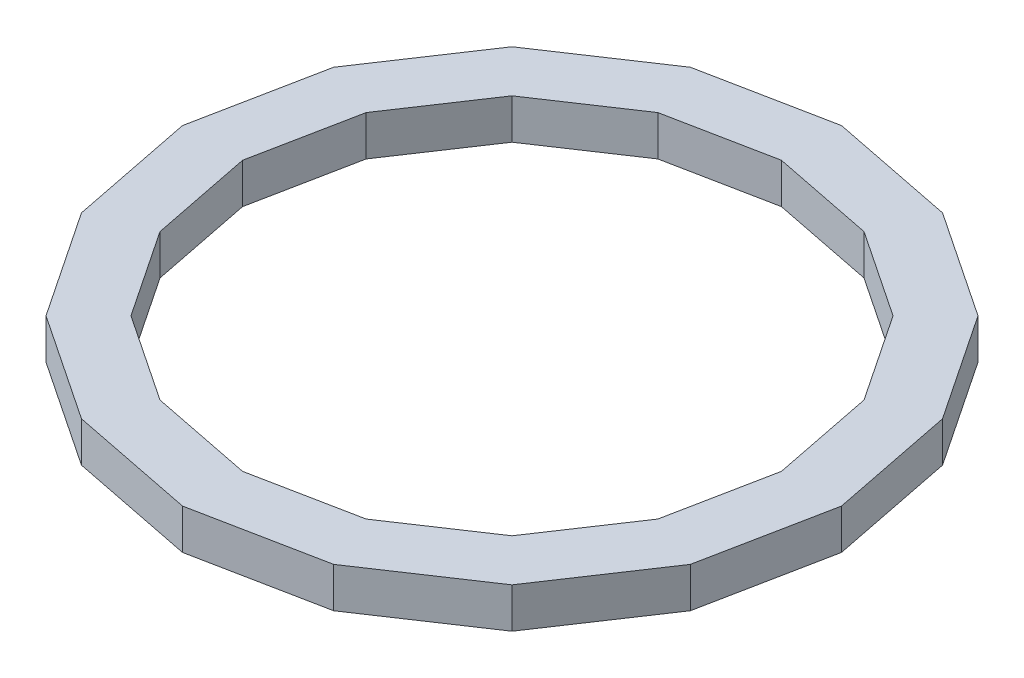
ISO-10303-21;
HEADER;
FILE_DESCRIPTION(('STEP AP214'),'2;1');
FILE_NAME('part.step','',(''),(''),'','','');
FILE_SCHEMA(('AUTOMOTIVE_DESIGN { 1 0 10303 214 1 1 1 1 }'));
ENDSEC;
DATA;
#1=APPLICATION_CONTEXT('core data for automotive mechanical design processes');
#2=APPLICATION_PROTOCOL_DEFINITION('international standard','automotive_design',2000,#1);
#3=PRODUCT_CONTEXT('',#1,'mechanical');
#4=PRODUCT('Part','Part','',(#3));
#5=PRODUCT_RELATED_PRODUCT_CATEGORY('part','',(#4));
#6=PRODUCT_DEFINITION_FORMATION('','',#4);
#7=PRODUCT_DEFINITION_CONTEXT('part definition',#1,'design');
#8=PRODUCT_DEFINITION('design','',#6,#7);
#9=PRODUCT_DEFINITION_SHAPE('','',#8);
#10=(LENGTH_UNIT() NAMED_UNIT(*) SI_UNIT(.MILLI.,.METRE.));
#11=(NAMED_UNIT(*) PLANE_ANGLE_UNIT() SI_UNIT($,.RADIAN.));
#12=(NAMED_UNIT(*) SI_UNIT($,.STERADIAN.) SOLID_ANGLE_UNIT());
#13=UNCERTAINTY_MEASURE_WITH_UNIT(LENGTH_MEASURE(1.E-05),#10,'distance_accuracy_value','');
#14=(GEOMETRIC_REPRESENTATION_CONTEXT(3) GLOBAL_UNCERTAINTY_ASSIGNED_CONTEXT((#13)) GLOBAL_UNIT_ASSIGNED_CONTEXT((#10,
#11,#12)) REPRESENTATION_CONTEXT('',''));
#15=CARTESIAN_POINT('',(0.,0.,0.));
#16=DIRECTION('',(0.,0.,1.));
#17=DIRECTION('',(1.,0.,0.));
#18=AXIS2_PLACEMENT_3D('',#15,#16,#17);
#19=CARTESIAN_POINT('',(0.,19.05,0.));
#20=DIRECTION('',(0.,1.,0.));
#21=DIRECTION('',(0.,0.,1.));
#22=AXIS2_PLACEMENT_3D('',#19,#20,#21);
#23=PLANE('',#22);
#24=DIRECTION('',(0.195090322016118,0.,-0.980785280403233));
#25=VECTOR('',#24,1.);
#26=CARTESIAN_POINT('',(144.34261966422,19.05,59.7886706933794));
#27=LINE('',#26,#25);
#28=CARTESIAN_POINT('',(144.34261966422,19.05,59.7886706933794));
#29=VERTEX_POINT('',#28);
#30=CARTESIAN_POINT('',(156.235325694322,19.05,-1.53332393890629E-12));
#31=VERTEX_POINT('',#30);
#32=EDGE_CURVE('E367',#29,#31,#27,.T.);
#33=ORIENTED_EDGE('',*,*,#32,.T.);
#34=DIRECTION('',(-0.195090322016139,0.,-0.980785280403228));
#35=VECTOR('',#34,1.);
#36=CARTESIAN_POINT('',(156.235325694322,19.05,-1.53332393890629E-12));
#37=LINE('',#36,#35);
#38=CARTESIAN_POINT('',(144.342619664218,19.05,-59.7886706933825));
#39=VERTEX_POINT('',#38);
#40=EDGE_CURVE('E370',#31,#39,#37,.T.);
#41=ORIENTED_EDGE('',*,*,#40,.T.);
#42=DIRECTION('',(-0.555570233019611,0.,-0.831469612302539));
#43=VECTOR('',#42,1.);
#44=CARTESIAN_POINT('',(144.342619664218,19.05,-59.7886706933825));
#45=LINE('',#44,#43);
#46=CARTESIAN_POINT('',(110.475058259343,19.05,-110.475058259345));
#47=VERTEX_POINT('',#46);
#48=EDGE_CURVE('E374',#39,#47,#45,.T.);
#49=ORIENTED_EDGE('',*,*,#48,.T.);
#50=DIRECTION('',(-0.831469612302551,0.,-0.555570233019593));
#51=VECTOR('',#50,1.);
#52=CARTESIAN_POINT('',(110.475058259343,19.05,-110.475058259345));
#53=LINE('',#52,#51);
#54=CARTESIAN_POINT('',(59.7886706933795,19.05,-144.34261966422));
#55=VERTEX_POINT('',#54);
#56=EDGE_CURVE('E376',#47,#55,#53,.T.);
#57=ORIENTED_EDGE('',*,*,#56,.T.);
#58=DIRECTION('',(-0.980785280403232,0.,-0.195090322016118));
#59=VECTOR('',#58,1.);
#60=CARTESIAN_POINT('',(59.7886706933795,19.05,-144.34261966422));
#61=LINE('',#60,#59);
#62=CARTESIAN_POINT('',(-1.71396367748445E-12,19.05,-156.235325694322));
#63=VERTEX_POINT('',#62);
#64=EDGE_CURVE('E378',#55,#63,#61,.T.);
#65=ORIENTED_EDGE('',*,*,#64,.T.);
#66=DIRECTION('',(-0.980785280403228,0.,0.195090322016139));
#67=VECTOR('',#66,1.);
#68=CARTESIAN_POINT('',(-1.71396367748445E-12,19.05,-156.235325694322));
#69=LINE('',#68,#67);
#70=CARTESIAN_POINT('',(-59.7886706933825,19.05,-144.342619664218));
#71=VERTEX_POINT('',#70);
#72=EDGE_CURVE('E380',#63,#71,#69,.T.);
#73=ORIENTED_EDGE('',*,*,#72,.T.);
#74=DIRECTION('',(-0.831469612302539,0.,0.555570233019611));
#75=VECTOR('',#74,1.);
#76=CARTESIAN_POINT('',(-59.7886706933825,19.05,-144.342619664218));
#77=LINE('',#76,#75);
#78=CARTESIAN_POINT('',(-110.475058259345,19.05,-110.475058259343));
#79=VERTEX_POINT('',#78);
#80=EDGE_CURVE('E382',#71,#79,#77,.T.);
#81=ORIENTED_EDGE('',*,*,#80,.T.);
#82=DIRECTION('',(-0.555570233019593,0.,0.831469612302551));
#83=VECTOR('',#82,1.);
#84=CARTESIAN_POINT('',(-110.475058259345,19.05,-110.475058259343));
#85=LINE('',#84,#83);
#86=CARTESIAN_POINT('',(-144.34261966422,19.05,-59.7886706933793));
#87=VERTEX_POINT('',#86);
#88=EDGE_CURVE('E384',#79,#87,#85,.T.);
#89=ORIENTED_EDGE('',*,*,#88,.T.);
#90=DIRECTION('',(-0.195090322016118,0.,0.980785280403232));
#91=VECTOR('',#90,1.);
#92=CARTESIAN_POINT('',(-144.34261966422,19.05,-59.7886706933793));
#93=LINE('',#92,#91);
#94=CARTESIAN_POINT('',(-156.235325694322,19.05,1.74513715930515E-12));
#95=VERTEX_POINT('',#94);
#96=EDGE_CURVE('E386',#87,#95,#93,.T.);
#97=ORIENTED_EDGE('',*,*,#96,.T.);
#98=DIRECTION('',(0.195090322016139,0.,0.980785280403228));
#99=VECTOR('',#98,1.);
#100=CARTESIAN_POINT('',(-156.235325694322,19.05,1.74513715930515E-12));
#101=LINE('',#100,#99);
#102=CARTESIAN_POINT('',(-144.342619664218,19.05,59.7886706933825));
#103=VERTEX_POINT('',#102);
#104=EDGE_CURVE('E388',#95,#103,#101,.T.);
#105=ORIENTED_EDGE('',*,*,#104,.T.);
#106=DIRECTION('',(0.555570233019611,0.,0.831469612302539));
#107=VECTOR('',#106,1.);
#108=CARTESIAN_POINT('',(-144.342619664218,19.05,59.7886706933825));
#109=LINE('',#108,#107);
#110=CARTESIAN_POINT('',(-110.475058259343,19.05,110.475058259345));
#111=VERTEX_POINT('',#110);
#112=EDGE_CURVE('E390',#103,#111,#109,.T.);
#113=ORIENTED_EDGE('',*,*,#112,.T.);
#114=DIRECTION('',(0.831469612302551,0.,0.555570233019593));
#115=VECTOR('',#114,1.);
#116=CARTESIAN_POINT('',(-110.475058259343,19.05,110.475058259345));
#117=LINE('',#116,#115);
#118=CARTESIAN_POINT('',(-59.7886706933793,19.05,144.34261966422));
#119=VERTEX_POINT('',#118);
#120=EDGE_CURVE('E392',#111,#119,#117,.T.);
#121=ORIENTED_EDGE('',*,*,#120,.T.);
#122=DIRECTION('',(0.980785280403232,0.,0.195090322016118));
#123=VECTOR('',#122,1.);
#124=CARTESIAN_POINT('',(-59.7886706933793,19.05,144.34261966422));
#125=LINE('',#124,#123);
#126=CARTESIAN_POINT('',(1.65930643270855E-12,19.05,156.235325694322));
#127=VERTEX_POINT('',#126);
#128=EDGE_CURVE('E394',#119,#127,#125,.T.);
#129=ORIENTED_EDGE('',*,*,#128,.T.);
#130=DIRECTION('',(0.980785280403228,0.,-0.195090322016139));
#131=VECTOR('',#130,1.);
#132=CARTESIAN_POINT('',(1.65930643270855E-12,19.05,156.235325694322));
#133=LINE('',#132,#131);
#134=CARTESIAN_POINT('',(59.7886706933825,19.05,144.342619664218));
#135=VERTEX_POINT('',#134);
#136=EDGE_CURVE('E397',#127,#135,#133,.T.);
#137=ORIENTED_EDGE('',*,*,#136,.T.);
#138=DIRECTION('',(0.831469612302539,0.,-0.555570233019611));
#139=VECTOR('',#138,1.);
#140=CARTESIAN_POINT('',(59.7886706933825,19.05,144.342619664218));
#141=LINE('',#140,#139);
#142=CARTESIAN_POINT('',(110.475058259345,19.05,110.475058259343));
#143=VERTEX_POINT('',#142);
#144=EDGE_CURVE('E399',#135,#143,#141,.T.);
#145=ORIENTED_EDGE('',*,*,#144,.T.);
#146=DIRECTION('',(0.555570233019593,0.,-0.831469612302551));
#147=VECTOR('',#146,1.);
#148=CARTESIAN_POINT('',(110.475058259345,19.05,110.475058259343));
#149=LINE('',#148,#147);
#150=EDGE_CURVE('E401',#143,#29,#149,.T.);
#151=ORIENTED_EDGE('',*,*,#150,.T.);
#152=EDGE_LOOP('',(#33,#41,#49,#57,#65,#73,#81,#89,#97,#105,#113,#121,#129,#137,#145,#151));
#153=FACE_BOUND('',#152,.T.);
#154=DIRECTION('',(-0.195090322016139,0.,-0.980785280403228));
#155=VECTOR('',#154,1.);
#156=CARTESIAN_POINT('',(127.747948733982,19.05,-1.42966776699409E-12));
#157=LINE('',#156,#155);
#158=CARTESIAN_POINT('',(127.747948733982,19.05,-1.42966776699409E-12));
#159=VERTEX_POINT('',#158);
#160=CARTESIAN_POINT('',(118.023715155626,19.05,-48.8870234991209));
#161=VERTEX_POINT('',#160);
#162=EDGE_CURVE('E252',#159,#161,#157,.T.);
#163=ORIENTED_EDGE('',*,*,#162,.F.);
#164=DIRECTION('',(0.195090322016118,0.,-0.980785280403233));
#165=VECTOR('',#164,1.);
#166=CARTESIAN_POINT('',(118.023715155627,19.05,48.8870234991184));
#167=LINE('',#166,#165);
#168=CARTESIAN_POINT('',(118.023715155627,19.05,48.8870234991184));
#169=VERTEX_POINT('',#168);
#170=EDGE_CURVE('E244',#169,#159,#167,.T.);
#171=ORIENTED_EDGE('',*,*,#170,.F.);
#172=DIRECTION('',(0.555570233019593,0.,-0.831469612302551));
#173=VECTOR('',#172,1.);
#174=CARTESIAN_POINT('',(90.3314408324709,19.05,90.331440832469));
#175=LINE('',#174,#173);
#176=CARTESIAN_POINT('',(90.3314408324709,19.05,90.331440832469));
#177=VERTEX_POINT('',#176);
#178=EDGE_CURVE('E293',#177,#169,#175,.T.);
#179=ORIENTED_EDGE('',*,*,#178,.F.);
#180=DIRECTION('',(0.831469612302539,0.,-0.555570233019611));
#181=VECTOR('',#180,1.);
#182=CARTESIAN_POINT('',(48.8870234991209,19.05,118.023715155626));
#183=LINE('',#182,#181);
#184=CARTESIAN_POINT('',(48.8870234991209,19.05,118.023715155626));
#185=VERTEX_POINT('',#184);
#186=EDGE_CURVE('E291',#185,#177,#183,.T.);
#187=ORIENTED_EDGE('',*,*,#186,.F.);
#188=DIRECTION('',(0.980785280403228,0.,-0.195090322016139));
#189=VECTOR('',#188,1.);
#190=CARTESIAN_POINT('',(1.43379152147094E-12,19.05,127.747948733982));
#191=LINE('',#190,#189);
#192=CARTESIAN_POINT('',(1.43379152147094E-12,19.05,127.747948733982));
#193=VERTEX_POINT('',#192);
#194=EDGE_CURVE('E289',#193,#185,#191,.T.);
#195=ORIENTED_EDGE('',*,*,#194,.F.);
#196=DIRECTION('',(0.980785280403233,0.,0.195090322016118));
#197=VECTOR('',#196,1.);
#198=CARTESIAN_POINT('',(-48.8870234991183,19.05,118.023715155627));
#199=LINE('',#198,#197);
#200=CARTESIAN_POINT('',(-48.8870234991183,19.05,118.023715155627));
#201=VERTEX_POINT('',#200);
#202=EDGE_CURVE('E287',#201,#193,#199,.T.);
#203=ORIENTED_EDGE('',*,*,#202,.F.);
#204=DIRECTION('',(0.831469612302551,0.,0.555570233019593));
#205=VECTOR('',#204,1.);
#206=CARTESIAN_POINT('',(-90.3314408324689,19.05,90.3314408324709));
#207=LINE('',#206,#205);
#208=CARTESIAN_POINT('',(-90.3314408324689,19.05,90.3314408324709));
#209=VERTEX_POINT('',#208);
#210=EDGE_CURVE('E285',#209,#201,#207,.T.);
#211=ORIENTED_EDGE('',*,*,#210,.F.);
#212=DIRECTION('',(0.555570233019612,0.,0.831469612302539));
#213=VECTOR('',#212,1.);
#214=CARTESIAN_POINT('',(-118.023715155626,19.05,48.887023499121));
#215=LINE('',#214,#213);
#216=CARTESIAN_POINT('',(-118.023715155626,19.05,48.887023499121));
#217=VERTEX_POINT('',#216);
#218=EDGE_CURVE('E283',#217,#209,#215,.T.);
#219=ORIENTED_EDGE('',*,*,#218,.F.);
#220=DIRECTION('',(0.195090322016139,0.,0.980785280403228));
#221=VECTOR('',#220,1.);
#222=CARTESIAN_POINT('',(-127.747948733982,19.05,1.31926422916292E-12));
#223=LINE('',#222,#221);
#224=CARTESIAN_POINT('',(-127.747948733982,19.05,1.31926422916292E-12));
#225=VERTEX_POINT('',#224);
#226=EDGE_CURVE('E281',#225,#217,#223,.T.);
#227=ORIENTED_EDGE('',*,*,#226,.F.);
#228=DIRECTION('',(-0.195090322016118,0.,0.980785280403233));
#229=VECTOR('',#228,1.);
#230=CARTESIAN_POINT('',(-118.023715155627,19.05,-48.8870234991184));
#231=LINE('',#230,#229);
#232=CARTESIAN_POINT('',(-118.023715155627,19.05,-48.8870234991184));
#233=VERTEX_POINT('',#232);
#234=EDGE_CURVE('E279',#233,#225,#231,.T.);
#235=ORIENTED_EDGE('',*,*,#234,.F.);
#236=DIRECTION('',(-0.555570233019593,0.,0.831469612302551));
#237=VECTOR('',#236,1.);
#238=CARTESIAN_POINT('',(-90.3314408324709,19.05,-90.331440832469));
#239=LINE('',#238,#237);
#240=CARTESIAN_POINT('',(-90.3314408324709,19.05,-90.331440832469));
#241=VERTEX_POINT('',#240);
#242=EDGE_CURVE('E277',#241,#233,#239,.T.);
#243=ORIENTED_EDGE('',*,*,#242,.F.);
#244=DIRECTION('',(-0.831469612302539,0.,0.555570233019611));
#245=VECTOR('',#244,1.);
#246=CARTESIAN_POINT('',(-48.887023499121,19.05,-118.023715155626));
#247=LINE('',#246,#245);
#248=CARTESIAN_POINT('',(-48.887023499121,19.05,-118.023715155626));
#249=VERTEX_POINT('',#248);
#250=EDGE_CURVE('E275',#249,#241,#247,.T.);
#251=ORIENTED_EDGE('',*,*,#250,.F.);
#252=DIRECTION('',(-0.980785280403228,0.,0.195090322016139));
#253=VECTOR('',#252,1.);
#254=CARTESIAN_POINT('',(-1.38800986815909E-12,19.05,-127.747948733982));
#255=LINE('',#254,#253);
#256=CARTESIAN_POINT('',(-1.38800986815909E-12,19.05,-127.747948733982));
#257=VERTEX_POINT('',#256);
#258=EDGE_CURVE('E273',#257,#249,#255,.T.);
#259=ORIENTED_EDGE('',*,*,#258,.F.);
#260=DIRECTION('',(-0.980785280403233,0.,-0.195090322016118));
#261=VECTOR('',#260,1.);
#262=CARTESIAN_POINT('',(48.8870234991182,19.05,-118.023715155627));
#263=LINE('',#262,#261);
#264=CARTESIAN_POINT('',(48.8870234991182,19.05,-118.023715155627));
#265=VERTEX_POINT('',#264);
#266=EDGE_CURVE('E271',#265,#257,#263,.T.);
#267=ORIENTED_EDGE('',*,*,#266,.F.);
#268=DIRECTION('',(-0.831469612302551,0.,-0.555570233019593));
#269=VECTOR('',#268,1.);
#270=CARTESIAN_POINT('',(90.3314408324689,19.05,-90.3314408324708));
#271=LINE('',#270,#269);
#272=CARTESIAN_POINT('',(90.3314408324689,19.05,-90.3314408324708));
#273=VERTEX_POINT('',#272);
#274=EDGE_CURVE('E267',#273,#265,#271,.T.);
#275=ORIENTED_EDGE('',*,*,#274,.F.);
#276=DIRECTION('',(-0.555570233019611,0.,-0.831469612302539));
#277=VECTOR('',#276,1.);
#278=CARTESIAN_POINT('',(118.023715155626,19.05,-48.8870234991209));
#279=LINE('',#278,#277);
#280=EDGE_CURVE('E265',#161,#273,#279,.T.);
#281=ORIENTED_EDGE('',*,*,#280,.F.);
#282=EDGE_LOOP('',(#163,#171,#179,#187,#195,#203,#211,#219,#227,#235,#243,#251,#259,#267,#275,#281));
#283=FACE_BOUND('',#282,.T.);
#284=ADVANCED_FACE('F35',(#153,#283),#23,.T.);
#285=CARTESIAN_POINT('',(0.,0.,0.));
#286=DIRECTION('',(0.,1.,0.));
#287=DIRECTION('',(0.,0.,1.));
#288=AXIS2_PLACEMENT_3D('',#285,#286,#287);
#289=PLANE('',#288);
#290=DIRECTION('',(0.195090322016118,0.,-0.980785280403233));
#291=VECTOR('',#290,1.);
#292=CARTESIAN_POINT('',(144.34261966422,0.,59.7886706933794));
#293=LINE('',#292,#291);
#294=CARTESIAN_POINT('',(144.34261966422,0.,59.7886706933794));
#295=VERTEX_POINT('',#294);
#296=CARTESIAN_POINT('',(156.235325694322,0.,-1.53332393890629E-12));
#297=VERTEX_POINT('',#296);
#298=EDGE_CURVE('E260',#295,#297,#293,.T.);
#299=ORIENTED_EDGE('',*,*,#298,.F.);
#300=DIRECTION('',(0.555570233019593,0.,-0.831469612302551));
#301=VECTOR('',#300,1.);
#302=CARTESIAN_POINT('',(110.475058259345,0.,110.475058259343));
#303=LINE('',#302,#301);
#304=CARTESIAN_POINT('',(110.475058259345,0.,110.475058259343));
#305=VERTEX_POINT('',#304);
#306=EDGE_CURVE('E371',#305,#295,#303,.T.);
#307=ORIENTED_EDGE('',*,*,#306,.F.);
#308=DIRECTION('',(0.831469612302539,0.,-0.555570233019611));
#309=VECTOR('',#308,1.);
#310=CARTESIAN_POINT('',(59.7886706933825,0.,144.342619664218));
#311=LINE('',#310,#309);
#312=CARTESIAN_POINT('',(59.7886706933825,0.,144.342619664218));
#313=VERTEX_POINT('',#312);
#314=EDGE_CURVE('E435',#313,#305,#311,.T.);
#315=ORIENTED_EDGE('',*,*,#314,.F.);
#316=DIRECTION('',(0.980785280403228,0.,-0.195090322016139));
#317=VECTOR('',#316,1.);
#318=CARTESIAN_POINT('',(1.65930643270855E-12,0.,156.235325694322));
#319=LINE('',#318,#317);
#320=CARTESIAN_POINT('',(1.65930643270855E-12,0.,156.235325694322));
#321=VERTEX_POINT('',#320);
#322=EDGE_CURVE('E433',#321,#313,#319,.T.);
#323=ORIENTED_EDGE('',*,*,#322,.F.);
#324=DIRECTION('',(0.980785280403232,0.,0.195090322016118));
#325=VECTOR('',#324,1.);
#326=CARTESIAN_POINT('',(-59.7886706933793,0.,144.34261966422));
#327=LINE('',#326,#325);
#328=CARTESIAN_POINT('',(-59.7886706933793,0.,144.34261966422));
#329=VERTEX_POINT('',#328);
#330=EDGE_CURVE('E431',#329,#321,#327,.T.);
#331=ORIENTED_EDGE('',*,*,#330,.F.);
#332=DIRECTION('',(0.831469612302551,0.,0.555570233019593));
#333=VECTOR('',#332,1.);
#334=CARTESIAN_POINT('',(-110.475058259343,0.,110.475058259345));
#335=LINE('',#334,#333);
#336=CARTESIAN_POINT('',(-110.475058259343,0.,110.475058259345));
#337=VERTEX_POINT('',#336);
#338=EDGE_CURVE('E429',#337,#329,#335,.T.);
#339=ORIENTED_EDGE('',*,*,#338,.F.);
#340=DIRECTION('',(0.555570233019611,0.,0.831469612302539));
#341=VECTOR('',#340,1.);
#342=CARTESIAN_POINT('',(-144.342619664218,0.,59.7886706933825));
#343=LINE('',#342,#341);
#344=CARTESIAN_POINT('',(-144.342619664218,0.,59.7886706933825));
#345=VERTEX_POINT('',#344);
#346=EDGE_CURVE('E427',#345,#337,#343,.T.);
#347=ORIENTED_EDGE('',*,*,#346,.F.);
#348=DIRECTION('',(0.195090322016139,0.,0.980785280403228));
#349=VECTOR('',#348,1.);
#350=CARTESIAN_POINT('',(-156.235325694322,0.,1.74513715930515E-12));
#351=LINE('',#350,#349);
#352=CARTESIAN_POINT('',(-156.235325694322,0.,1.74513715930515E-12));
#353=VERTEX_POINT('',#352);
#354=EDGE_CURVE('E425',#353,#345,#351,.T.);
#355=ORIENTED_EDGE('',*,*,#354,.F.);
#356=DIRECTION('',(-0.195090322016118,0.,0.980785280403232));
#357=VECTOR('',#356,1.);
#358=CARTESIAN_POINT('',(-144.34261966422,0.,-59.7886706933793));
#359=LINE('',#358,#357);
#360=CARTESIAN_POINT('',(-144.34261966422,0.,-59.7886706933793));
#361=VERTEX_POINT('',#360);
#362=EDGE_CURVE('E422',#361,#353,#359,.T.);
#363=ORIENTED_EDGE('',*,*,#362,.F.);
#364=DIRECTION('',(-0.555570233019593,0.,0.831469612302551));
#365=VECTOR('',#364,1.);
#366=CARTESIAN_POINT('',(-110.475058259345,0.,-110.475058259343));
#367=LINE('',#366,#365);
#368=CARTESIAN_POINT('',(-110.475058259345,0.,-110.475058259343));
#369=VERTEX_POINT('',#368);
#370=EDGE_CURVE('E420',#369,#361,#367,.T.);
#371=ORIENTED_EDGE('',*,*,#370,.F.);
#372=DIRECTION('',(-0.831469612302539,0.,0.555570233019611));
#373=VECTOR('',#372,1.);
#374=CARTESIAN_POINT('',(-59.7886706933825,0.,-144.342619664218));
#375=LINE('',#374,#373);
#376=CARTESIAN_POINT('',(-59.7886706933825,0.,-144.342619664218));
#377=VERTEX_POINT('',#376);
#378=EDGE_CURVE('E418',#377,#369,#375,.T.);
#379=ORIENTED_EDGE('',*,*,#378,.F.);
#380=DIRECTION('',(-0.980785280403228,0.,0.195090322016139));
#381=VECTOR('',#380,1.);
#382=CARTESIAN_POINT('',(-1.71396367748445E-12,0.,-156.235325694322));
#383=LINE('',#382,#381);
#384=CARTESIAN_POINT('',(-1.71396367748445E-12,0.,-156.235325694322));
#385=VERTEX_POINT('',#384);
#386=EDGE_CURVE('E416',#385,#377,#383,.T.);
#387=ORIENTED_EDGE('',*,*,#386,.F.);
#388=DIRECTION('',(-0.980785280403232,0.,-0.195090322016118));
#389=VECTOR('',#388,1.);
#390=CARTESIAN_POINT('',(59.7886706933795,0.,-144.34261966422));
#391=LINE('',#390,#389);
#392=CARTESIAN_POINT('',(59.7886706933795,0.,-144.34261966422));
#393=VERTEX_POINT('',#392);
#394=EDGE_CURVE('E414',#393,#385,#391,.T.);
#395=ORIENTED_EDGE('',*,*,#394,.F.);
#396=DIRECTION('',(-0.831469612302551,0.,-0.555570233019593));
#397=VECTOR('',#396,1.);
#398=CARTESIAN_POINT('',(110.475058259343,0.,-110.475058259345));
#399=LINE('',#398,#397);
#400=CARTESIAN_POINT('',(110.475058259343,0.,-110.475058259345));
#401=VERTEX_POINT('',#400);
#402=EDGE_CURVE('E412',#401,#393,#399,.T.);
#403=ORIENTED_EDGE('',*,*,#402,.F.);
#404=DIRECTION('',(-0.555570233019611,0.,-0.831469612302539));
#405=VECTOR('',#404,1.);
#406=CARTESIAN_POINT('',(144.342619664218,0.,-59.7886706933825));
#407=LINE('',#406,#405);
#408=CARTESIAN_POINT('',(144.342619664218,0.,-59.7886706933825));
#409=VERTEX_POINT('',#408);
#410=EDGE_CURVE('E409',#409,#401,#407,.T.);
#411=ORIENTED_EDGE('',*,*,#410,.F.);
#412=DIRECTION('',(-0.195090322016139,0.,-0.980785280403228));
#413=VECTOR('',#412,1.);
#414=CARTESIAN_POINT('',(156.235325694322,0.,-1.53332393890629E-12));
#415=LINE('',#414,#413);
#416=EDGE_CURVE('E406',#297,#409,#415,.T.);
#417=ORIENTED_EDGE('',*,*,#416,.F.);
#418=EDGE_LOOP('',(#299,#307,#315,#323,#331,#339,#347,#355,#363,#371,#379,#387,#395,#403,#411,#417));
#419=FACE_BOUND('',#418,.T.);
#420=DIRECTION('',(0.195090322016118,0.,-0.980785280403233));
#421=VECTOR('',#420,1.);
#422=CARTESIAN_POINT('',(118.023715155627,0.,48.8870234991184));
#423=LINE('',#422,#421);
#424=CARTESIAN_POINT('',(118.023715155627,0.,48.8870234991184));
#425=VERTEX_POINT('',#424);
#426=CARTESIAN_POINT('',(127.747948733982,0.,-1.42966776699409E-12));
#427=VERTEX_POINT('',#426);
#428=EDGE_CURVE('E58',#425,#427,#423,.T.);
#429=ORIENTED_EDGE('',*,*,#428,.T.);
#430=DIRECTION('',(-0.195090322016139,0.,-0.980785280403228));
#431=VECTOR('',#430,1.);
#432=CARTESIAN_POINT('',(127.747948733982,0.,-1.42966776699409E-12));
#433=LINE('',#432,#431);
#434=CARTESIAN_POINT('',(118.023715155626,0.,-48.8870234991209));
#435=VERTEX_POINT('',#434);
#436=EDGE_CURVE('E259',#427,#435,#433,.T.);
#437=ORIENTED_EDGE('',*,*,#436,.T.);
#438=DIRECTION('',(-0.555570233019611,0.,-0.831469612302539));
#439=VECTOR('',#438,1.);
#440=CARTESIAN_POINT('',(118.023715155626,0.,-48.8870234991209));
#441=LINE('',#440,#439);
#442=CARTESIAN_POINT('',(90.3314408324689,0.,-90.3314408324708));
#443=VERTEX_POINT('',#442);
#444=EDGE_CURVE('E297',#435,#443,#441,.T.);
#445=ORIENTED_EDGE('',*,*,#444,.T.);
#446=DIRECTION('',(-0.831469612302551,0.,-0.555570233019593));
#447=VECTOR('',#446,1.);
#448=CARTESIAN_POINT('',(90.3314408324689,0.,-90.3314408324708));
#449=LINE('',#448,#447);
#450=CARTESIAN_POINT('',(48.8870234991182,0.,-118.023715155627));
#451=VERTEX_POINT('',#450);
#452=EDGE_CURVE('E300',#443,#451,#449,.T.);
#453=ORIENTED_EDGE('',*,*,#452,.T.);
#454=DIRECTION('',(-0.980785280403233,0.,-0.195090322016118));
#455=VECTOR('',#454,1.);
#456=CARTESIAN_POINT('',(48.8870234991182,0.,-118.023715155627));
#457=LINE('',#456,#455);
#458=CARTESIAN_POINT('',(-1.38800986815909E-12,0.,-127.747948733982));
#459=VERTEX_POINT('',#458);
#460=EDGE_CURVE('E304',#451,#459,#457,.T.);
#461=ORIENTED_EDGE('',*,*,#460,.T.);
#462=DIRECTION('',(-0.980785280403228,0.,0.195090322016139));
#463=VECTOR('',#462,1.);
#464=CARTESIAN_POINT('',(-1.38800986815909E-12,0.,-127.747948733982));
#465=LINE('',#464,#463);
#466=CARTESIAN_POINT('',(-48.887023499121,0.,-118.023715155626));
#467=VERTEX_POINT('',#466);
#468=EDGE_CURVE('E307',#459,#467,#465,.T.);
#469=ORIENTED_EDGE('',*,*,#468,.T.);
#470=DIRECTION('',(-0.831469612302539,0.,0.555570233019611));
#471=VECTOR('',#470,1.);
#472=CARTESIAN_POINT('',(-48.887023499121,0.,-118.023715155626));
#473=LINE('',#472,#471);
#474=CARTESIAN_POINT('',(-90.3314408324709,0.,-90.331440832469));
#475=VERTEX_POINT('',#474);
#476=EDGE_CURVE('E310',#467,#475,#473,.T.);
#477=ORIENTED_EDGE('',*,*,#476,.T.);
#478=DIRECTION('',(-0.555570233019593,0.,0.831469612302551));
#479=VECTOR('',#478,1.);
#480=CARTESIAN_POINT('',(-90.3314408324709,0.,-90.331440832469));
#481=LINE('',#480,#479);
#482=CARTESIAN_POINT('',(-118.023715155627,0.,-48.8870234991184));
#483=VERTEX_POINT('',#482);
#484=EDGE_CURVE('E313',#475,#483,#481,.T.);
#485=ORIENTED_EDGE('',*,*,#484,.T.);
#486=DIRECTION('',(-0.195090322016118,0.,0.980785280403233));
#487=VECTOR('',#486,1.);
#488=CARTESIAN_POINT('',(-118.023715155627,0.,-48.8870234991184));
#489=LINE('',#488,#487);
#490=CARTESIAN_POINT('',(-127.747948733982,0.,1.31926422916292E-12));
#491=VERTEX_POINT('',#490);
#492=EDGE_CURVE('E316',#483,#491,#489,.T.);
#493=ORIENTED_EDGE('',*,*,#492,.T.);
#494=DIRECTION('',(0.195090322016139,0.,0.980785280403228));
#495=VECTOR('',#494,1.);
#496=CARTESIAN_POINT('',(-127.747948733982,0.,1.31926422916292E-12));
#497=LINE('',#496,#495);
#498=CARTESIAN_POINT('',(-118.023715155626,0.,48.887023499121));
#499=VERTEX_POINT('',#498);
#500=EDGE_CURVE('E319',#491,#499,#497,.T.);
#501=ORIENTED_EDGE('',*,*,#500,.T.);
#502=DIRECTION('',(0.555570233019612,0.,0.831469612302539));
#503=VECTOR('',#502,1.);
#504=CARTESIAN_POINT('',(-118.023715155626,0.,48.887023499121));
#505=LINE('',#504,#503);
#506=CARTESIAN_POINT('',(-90.3314408324689,0.,90.3314408324709));
#507=VERTEX_POINT('',#506);
#508=EDGE_CURVE('E322',#499,#507,#505,.T.);
#509=ORIENTED_EDGE('',*,*,#508,.T.);
#510=DIRECTION('',(0.831469612302551,0.,0.555570233019593));
#511=VECTOR('',#510,1.);
#512=CARTESIAN_POINT('',(-90.3314408324689,0.,90.3314408324709));
#513=LINE('',#512,#511);
#514=CARTESIAN_POINT('',(-48.8870234991183,0.,118.023715155627));
#515=VERTEX_POINT('',#514);
#516=EDGE_CURVE('E325',#507,#515,#513,.T.);
#517=ORIENTED_EDGE('',*,*,#516,.T.);
#518=DIRECTION('',(0.980785280403233,0.,0.195090322016118));
#519=VECTOR('',#518,1.);
#520=CARTESIAN_POINT('',(-48.8870234991183,0.,118.023715155627));
#521=LINE('',#520,#519);
#522=CARTESIAN_POINT('',(1.43379152147094E-12,0.,127.747948733982));
#523=VERTEX_POINT('',#522);
#524=EDGE_CURVE('E328',#515,#523,#521,.T.);
#525=ORIENTED_EDGE('',*,*,#524,.T.);
#526=DIRECTION('',(0.980785280403228,0.,-0.195090322016139));
#527=VECTOR('',#526,1.);
#528=CARTESIAN_POINT('',(1.43379152147094E-12,0.,127.747948733982));
#529=LINE('',#528,#527);
#530=CARTESIAN_POINT('',(48.8870234991209,0.,118.023715155626));
#531=VERTEX_POINT('',#530);
#532=EDGE_CURVE('E332',#523,#531,#529,.T.);
#533=ORIENTED_EDGE('',*,*,#532,.T.);
#534=DIRECTION('',(0.831469612302539,0.,-0.555570233019611));
#535=VECTOR('',#534,1.);
#536=CARTESIAN_POINT('',(48.8870234991209,0.,118.023715155626));
#537=LINE('',#536,#535);
#538=CARTESIAN_POINT('',(90.3314408324709,0.,90.331440832469));
#539=VERTEX_POINT('',#538);
#540=EDGE_CURVE('E335',#531,#539,#537,.T.);
#541=ORIENTED_EDGE('',*,*,#540,.T.);
#542=DIRECTION('',(0.555570233019593,0.,-0.831469612302551));
#543=VECTOR('',#542,1.);
#544=CARTESIAN_POINT('',(90.3314408324709,0.,90.331440832469));
#545=LINE('',#544,#543);
#546=EDGE_CURVE('E253',#539,#425,#545,.T.);
#547=ORIENTED_EDGE('',*,*,#546,.T.);
#548=EDGE_LOOP('',(#429,#437,#445,#453,#461,#469,#477,#485,#493,#501,#509,#517,#525,#533,#541,#547));
#549=FACE_BOUND('',#548,.T.);
#550=ADVANCED_FACE('F495',(#419,#549),#289,.F.);
#551=CARTESIAN_POINT('',(144.34261966422,19.05,59.7886706933794));
#552=DIRECTION('',(-0.980785280403233,0.,-0.195090322016118));
#553=DIRECTION('',(-0.195090322016118,0.,0.980785280403233));
#554=AXIS2_PLACEMENT_3D('',#551,#552,#553);
#555=PLANE('',#554);
#556=ORIENTED_EDGE('',*,*,#298,.T.);
#557=DIRECTION('',(0.,-1.,0.));
#558=VECTOR('',#557,1.);
#559=CARTESIAN_POINT('',(156.235325694322,19.05,-1.53332393890629E-12));
#560=LINE('',#559,#558);
#561=EDGE_CURVE('E11',#31,#297,#560,.T.);
#562=ORIENTED_EDGE('',*,*,#561,.F.);
#563=ORIENTED_EDGE('',*,*,#32,.F.);
#564=DIRECTION('',(0.,-1.,0.));
#565=VECTOR('',#564,1.);
#566=CARTESIAN_POINT('',(144.34261966422,19.05,59.7886706933794));
#567=LINE('',#566,#565);
#568=EDGE_CURVE('E403',#29,#295,#567,.T.);
#569=ORIENTED_EDGE('',*,*,#568,.T.);
#570=EDGE_LOOP('',(#556,#562,#563,#569));
#571=FACE_BOUND('',#570,.T.);
#572=ADVANCED_FACE('F37',(#571),#555,.F.);
#573=CARTESIAN_POINT('',(156.235325694322,19.05,-1.53332393890629E-12));
#574=DIRECTION('',(-0.980785280403228,0.,0.195090322016139));
#575=DIRECTION('',(0.195090322016139,0.,0.980785280403228));
#576=AXIS2_PLACEMENT_3D('',#573,#574,#575);
#577=PLANE('',#576);
#578=ORIENTED_EDGE('',*,*,#416,.T.);
#579=DIRECTION('',(0.,-1.,0.));
#580=VECTOR('',#579,1.);
#581=CARTESIAN_POINT('',(144.342619664218,19.05,-59.7886706933825));
#582=LINE('',#581,#580);
#583=EDGE_CURVE('E43',#39,#409,#582,.T.);
#584=ORIENTED_EDGE('',*,*,#583,.F.);
#585=ORIENTED_EDGE('',*,*,#40,.F.);
#586=ORIENTED_EDGE('',*,*,#561,.T.);
#587=EDGE_LOOP('',(#578,#584,#585,#586));
#588=FACE_BOUND('',#587,.T.);
#589=ADVANCED_FACE('F512',(#588),#577,.F.);
#590=CARTESIAN_POINT('',(144.342619664218,19.05,-59.7886706933825));
#591=DIRECTION('',(-0.831469612302539,0.,0.555570233019611));
#592=DIRECTION('',(0.555570233019611,0.,0.831469612302539));
#593=AXIS2_PLACEMENT_3D('',#590,#591,#592);
#594=PLANE('',#593);
#595=ORIENTED_EDGE('',*,*,#410,.T.);
#596=DIRECTION('',(0.,-1.,0.));
#597=VECTOR('',#596,1.);
#598=CARTESIAN_POINT('',(110.475058259343,19.05,-110.475058259345));
#599=LINE('',#598,#597);
#600=EDGE_CURVE('E480',#47,#401,#599,.T.);
#601=ORIENTED_EDGE('',*,*,#600,.F.);
#602=ORIENTED_EDGE('',*,*,#48,.F.);
#603=ORIENTED_EDGE('',*,*,#583,.T.);
#604=EDGE_LOOP('',(#595,#601,#602,#603));
#605=FACE_BOUND('',#604,.T.);
#606=ADVANCED_FACE('F489',(#605),#594,.F.);
#607=CARTESIAN_POINT('',(110.475058259343,19.05,-110.475058259345));
#608=DIRECTION('',(-0.555570233019593,0.,0.831469612302551));
#609=DIRECTION('',(0.831469612302551,0.,0.555570233019593));
#610=AXIS2_PLACEMENT_3D('',#607,#608,#609);
#611=PLANE('',#610);
#612=ORIENTED_EDGE('',*,*,#402,.T.);
#613=DIRECTION('',(0.,-1.,0.));
#614=VECTOR('',#613,1.);
#615=CARTESIAN_POINT('',(59.7886706933795,19.05,-144.34261966422));
#616=LINE('',#615,#614);
#617=EDGE_CURVE('E477',#55,#393,#616,.T.);
#618=ORIENTED_EDGE('',*,*,#617,.F.);
#619=ORIENTED_EDGE('',*,*,#56,.F.);
#620=ORIENTED_EDGE('',*,*,#600,.T.);
#621=EDGE_LOOP('',(#612,#618,#619,#620));
#622=FACE_BOUND('',#621,.T.);
#623=ADVANCED_FACE('F501',(#622),#611,.F.);
#624=CARTESIAN_POINT('',(59.7886706933795,19.05,-144.34261966422));
#625=DIRECTION('',(-0.195090322016118,0.,0.980785280403232));
#626=DIRECTION('',(0.980785280403233,0.,0.195090322016118));
#627=AXIS2_PLACEMENT_3D('',#624,#625,#626);
#628=PLANE('',#627);
#629=ORIENTED_EDGE('',*,*,#394,.T.);
#630=DIRECTION('',(0.,-1.,0.));
#631=VECTOR('',#630,1.);
#632=CARTESIAN_POINT('',(-1.71396367748445E-12,19.05,-156.235325694322));
#633=LINE('',#632,#631);
#634=EDGE_CURVE('E474',#63,#385,#633,.T.);
#635=ORIENTED_EDGE('',*,*,#634,.F.);
#636=ORIENTED_EDGE('',*,*,#64,.F.);
#637=ORIENTED_EDGE('',*,*,#617,.T.);
#638=EDGE_LOOP('',(#629,#635,#636,#637));
#639=FACE_BOUND('',#638,.T.);
#640=ADVANCED_FACE('F505',(#639),#628,.F.);
#641=CARTESIAN_POINT('',(-1.71396367748445E-12,19.05,-156.235325694322));
#642=DIRECTION('',(0.195090322016139,0.,0.980785280403228));
#643=DIRECTION('',(0.980785280403228,0.,-0.195090322016139));
#644=AXIS2_PLACEMENT_3D('',#641,#642,#643);
#645=PLANE('',#644);
#646=ORIENTED_EDGE('',*,*,#386,.T.);
#647=DIRECTION('',(0.,-1.,0.));
#648=VECTOR('',#647,1.);
#649=CARTESIAN_POINT('',(-59.7886706933825,19.05,-144.342619664218));
#650=LINE('',#649,#648);
#651=EDGE_CURVE('E471',#71,#377,#650,.T.);
#652=ORIENTED_EDGE('',*,*,#651,.F.);
#653=ORIENTED_EDGE('',*,*,#72,.F.);
#654=ORIENTED_EDGE('',*,*,#634,.T.);
#655=EDGE_LOOP('',(#646,#652,#653,#654));
#656=FACE_BOUND('',#655,.T.);
#657=ADVANCED_FACE('F565',(#656),#645,.F.);
#658=CARTESIAN_POINT('',(-59.7886706933825,19.05,-144.342619664218));
#659=DIRECTION('',(0.555570233019611,0.,0.831469612302539));
#660=DIRECTION('',(0.831469612302539,0.,-0.555570233019612));
#661=AXIS2_PLACEMENT_3D('',#658,#659,#660);
#662=PLANE('',#661);
#663=ORIENTED_EDGE('',*,*,#378,.T.);
#664=DIRECTION('',(0.,-1.,0.));
#665=VECTOR('',#664,1.);
#666=CARTESIAN_POINT('',(-110.475058259345,19.05,-110.475058259343));
#667=LINE('',#666,#665);
#668=EDGE_CURVE('E468',#79,#369,#667,.T.);
#669=ORIENTED_EDGE('',*,*,#668,.F.);
#670=ORIENTED_EDGE('',*,*,#80,.F.);
#671=ORIENTED_EDGE('',*,*,#651,.T.);
#672=EDGE_LOOP('',(#663,#669,#670,#671));
#673=FACE_BOUND('',#672,.T.);
#674=ADVANCED_FACE('F562',(#673),#662,.F.);
#675=CARTESIAN_POINT('',(-110.475058259345,19.05,-110.475058259343));
#676=DIRECTION('',(0.831469612302551,0.,0.555570233019593));
#677=DIRECTION('',(0.555570233019593,0.,-0.831469612302551));
#678=AXIS2_PLACEMENT_3D('',#675,#676,#677);
#679=PLANE('',#678);
#680=ORIENTED_EDGE('',*,*,#370,.T.);
#681=DIRECTION('',(0.,-1.,0.));
#682=VECTOR('',#681,1.);
#683=CARTESIAN_POINT('',(-144.34261966422,19.05,-59.7886706933793));
#684=LINE('',#683,#682);
#685=EDGE_CURVE('E464',#87,#361,#684,.T.);
#686=ORIENTED_EDGE('',*,*,#685,.F.);
#687=ORIENTED_EDGE('',*,*,#88,.F.);
#688=ORIENTED_EDGE('',*,*,#668,.T.);
#689=EDGE_LOOP('',(#680,#686,#687,#688));
#690=FACE_BOUND('',#689,.T.);
#691=ADVANCED_FACE('F558',(#690),#679,.F.);
#692=CARTESIAN_POINT('',(-144.34261966422,19.05,-59.7886706933793));
#693=DIRECTION('',(0.980785280403233,0.,0.195090322016118));
#694=DIRECTION('',(0.195090322016118,0.,-0.980785280403233));
#695=AXIS2_PLACEMENT_3D('',#692,#693,#694);
#696=PLANE('',#695);
#697=ORIENTED_EDGE('',*,*,#362,.T.);
#698=DIRECTION('',(0.,-1.,0.));
#699=VECTOR('',#698,1.);
#700=CARTESIAN_POINT('',(-156.235325694322,19.05,1.74513715930515E-12));
#701=LINE('',#700,#699);
#702=EDGE_CURVE('E461',#95,#353,#701,.T.);
#703=ORIENTED_EDGE('',*,*,#702,.F.);
#704=ORIENTED_EDGE('',*,*,#96,.F.);
#705=ORIENTED_EDGE('',*,*,#685,.T.);
#706=EDGE_LOOP('',(#697,#703,#704,#705));
#707=FACE_BOUND('',#706,.T.);
#708=ADVANCED_FACE('F554',(#707),#696,.F.);
#709=CARTESIAN_POINT('',(-156.235325694322,19.05,1.74513715930515E-12));
#710=DIRECTION('',(0.980785280403228,0.,-0.195090322016139));
#711=DIRECTION('',(-0.195090322016139,0.,-0.980785280403228));
#712=AXIS2_PLACEMENT_3D('',#709,#710,#711);
#713=PLANE('',#712);
#714=ORIENTED_EDGE('',*,*,#354,.T.);
#715=DIRECTION('',(0.,-1.,0.));
#716=VECTOR('',#715,1.);
#717=CARTESIAN_POINT('',(-144.342619664218,19.05,59.7886706933825));
#718=LINE('',#717,#716);
#719=EDGE_CURVE('E458',#103,#345,#718,.T.);
#720=ORIENTED_EDGE('',*,*,#719,.F.);
#721=ORIENTED_EDGE('',*,*,#104,.F.);
#722=ORIENTED_EDGE('',*,*,#702,.T.);
#723=EDGE_LOOP('',(#714,#720,#721,#722));
#724=FACE_BOUND('',#723,.T.);
#725=ADVANCED_FACE('F549',(#724),#713,.F.);
#726=CARTESIAN_POINT('',(-144.342619664218,19.05,59.7886706933825));
#727=DIRECTION('',(0.831469612302539,0.,-0.555570233019611));
#728=DIRECTION('',(-0.555570233019611,0.,-0.831469612302539));
#729=AXIS2_PLACEMENT_3D('',#726,#727,#728);
#730=PLANE('',#729);
#731=ORIENTED_EDGE('',*,*,#346,.T.);
#732=DIRECTION('',(0.,-1.,0.));
#733=VECTOR('',#732,1.);
#734=CARTESIAN_POINT('',(-110.475058259343,19.05,110.475058259345));
#735=LINE('',#734,#733);
#736=EDGE_CURVE('E455',#111,#337,#735,.T.);
#737=ORIENTED_EDGE('',*,*,#736,.F.);
#738=ORIENTED_EDGE('',*,*,#112,.F.);
#739=ORIENTED_EDGE('',*,*,#719,.T.);
#740=EDGE_LOOP('',(#731,#737,#738,#739));
#741=FACE_BOUND('',#740,.T.);
#742=ADVANCED_FACE('F543',(#741),#730,.F.);
#743=CARTESIAN_POINT('',(-110.475058259343,19.05,110.475058259345));
#744=DIRECTION('',(0.555570233019593,0.,-0.831469612302551));
#745=DIRECTION('',(-0.831469612302551,0.,-0.555570233019593));
#746=AXIS2_PLACEMENT_3D('',#743,#744,#745);
#747=PLANE('',#746);
#748=ORIENTED_EDGE('',*,*,#338,.T.);
#749=DIRECTION('',(0.,-1.,0.));
#750=VECTOR('',#749,1.);
#751=CARTESIAN_POINT('',(-59.7886706933793,19.05,144.34261966422));
#752=LINE('',#751,#750);
#753=EDGE_CURVE('E451',#119,#329,#752,.T.);
#754=ORIENTED_EDGE('',*,*,#753,.F.);
#755=ORIENTED_EDGE('',*,*,#120,.F.);
#756=ORIENTED_EDGE('',*,*,#736,.T.);
#757=EDGE_LOOP('',(#748,#754,#755,#756));
#758=FACE_BOUND('',#757,.T.);
#759=ADVANCED_FACE('F539',(#758),#747,.F.);
#760=CARTESIAN_POINT('',(-59.7886706933793,19.05,144.34261966422));
#761=DIRECTION('',(0.195090322016118,0.,-0.980785280403232));
#762=DIRECTION('',(-0.980785280403233,0.,-0.195090322016118));
#763=AXIS2_PLACEMENT_3D('',#760,#761,#762);
#764=PLANE('',#763);
#765=ORIENTED_EDGE('',*,*,#330,.T.);
#766=DIRECTION('',(0.,-1.,0.));
#767=VECTOR('',#766,1.);
#768=CARTESIAN_POINT('',(1.65930643270855E-12,19.05,156.235325694322));
#769=LINE('',#768,#767);
#770=EDGE_CURVE('E447',#127,#321,#769,.T.);
#771=ORIENTED_EDGE('',*,*,#770,.F.);
#772=ORIENTED_EDGE('',*,*,#128,.F.);
#773=ORIENTED_EDGE('',*,*,#753,.T.);
#774=EDGE_LOOP('',(#765,#771,#772,#773));
#775=FACE_BOUND('',#774,.T.);
#776=ADVANCED_FACE('F534',(#775),#764,.F.);
#777=CARTESIAN_POINT('',(1.65930643270855E-12,19.05,156.235325694322));
#778=DIRECTION('',(-0.195090322016139,0.,-0.980785280403228));
#779=DIRECTION('',(-0.980785280403228,0.,0.195090322016139));
#780=AXIS2_PLACEMENT_3D('',#777,#778,#779);
#781=PLANE('',#780);
#782=ORIENTED_EDGE('',*,*,#322,.T.);
#783=DIRECTION('',(0.,-1.,0.));
#784=VECTOR('',#783,1.);
#785=CARTESIAN_POINT('',(59.7886706933825,19.05,144.342619664218));
#786=LINE('',#785,#784);
#787=EDGE_CURVE('E444',#135,#313,#786,.T.);
#788=ORIENTED_EDGE('',*,*,#787,.F.);
#789=ORIENTED_EDGE('',*,*,#136,.F.);
#790=ORIENTED_EDGE('',*,*,#770,.T.);
#791=EDGE_LOOP('',(#782,#788,#789,#790));
#792=FACE_BOUND('',#791,.T.);
#793=ADVANCED_FACE('F528',(#792),#781,.F.);
#794=CARTESIAN_POINT('',(59.7886706933825,19.05,144.342619664218));
#795=DIRECTION('',(-0.555570233019611,0.,-0.831469612302539));
#796=DIRECTION('',(-0.831469612302539,0.,0.555570233019611));
#797=AXIS2_PLACEMENT_3D('',#794,#795,#796);
#798=PLANE('',#797);
#799=ORIENTED_EDGE('',*,*,#314,.T.);
#800=DIRECTION('',(0.,-1.,0.));
#801=VECTOR('',#800,1.);
#802=CARTESIAN_POINT('',(110.475058259345,19.05,110.475058259343));
#803=LINE('',#802,#801);
#804=EDGE_CURVE('E441',#143,#305,#803,.T.);
#805=ORIENTED_EDGE('',*,*,#804,.F.);
#806=ORIENTED_EDGE('',*,*,#144,.F.);
#807=ORIENTED_EDGE('',*,*,#787,.T.);
#808=EDGE_LOOP('',(#799,#805,#806,#807));
#809=FACE_BOUND('',#808,.T.);
#810=ADVANCED_FACE('F524',(#809),#798,.F.);
#811=CARTESIAN_POINT('',(110.475058259345,19.05,110.475058259343));
#812=DIRECTION('',(-0.831469612302551,0.,-0.555570233019593));
#813=DIRECTION('',(-0.555570233019593,0.,0.831469612302551));
#814=AXIS2_PLACEMENT_3D('',#811,#812,#813);
#815=PLANE('',#814);
#816=ORIENTED_EDGE('',*,*,#306,.T.);
#817=ORIENTED_EDGE('',*,*,#568,.F.);
#818=ORIENTED_EDGE('',*,*,#150,.F.);
#819=ORIENTED_EDGE('',*,*,#804,.T.);
#820=EDGE_LOOP('',(#816,#817,#818,#819));
#821=FACE_BOUND('',#820,.T.);
#822=ADVANCED_FACE('F519',(#821),#815,.F.);
#823=CARTESIAN_POINT('',(118.023715155627,19.05,48.8870234991184));
#824=DIRECTION('',(-0.980785280403233,0.,-0.195090322016118));
#825=DIRECTION('',(-0.195090322016118,0.,0.980785280403233));
#826=AXIS2_PLACEMENT_3D('',#823,#824,#825);
#827=PLANE('',#826);
#828=ORIENTED_EDGE('',*,*,#428,.F.);
#829=DIRECTION('',(0.,-1.,0.));
#830=VECTOR('',#829,1.);
#831=CARTESIAN_POINT('',(118.023715155627,19.05,48.8870234991184));
#832=LINE('',#831,#830);
#833=EDGE_CURVE('E248',#169,#425,#832,.T.);
#834=ORIENTED_EDGE('',*,*,#833,.F.);
#835=ORIENTED_EDGE('',*,*,#170,.T.);
#836=DIRECTION('',(0.,-1.,0.));
#837=VECTOR('',#836,1.);
#838=CARTESIAN_POINT('',(127.747948733982,19.05,-1.42966776699409E-12));
#839=LINE('',#838,#837);
#840=EDGE_CURVE('E247',#159,#427,#839,.T.);
#841=ORIENTED_EDGE('',*,*,#840,.T.);
#842=EDGE_LOOP('',(#828,#834,#835,#841));
#843=FACE_BOUND('',#842,.T.);
#844=ADVANCED_FACE('F246',(#843),#827,.T.);
#845=CARTESIAN_POINT('',(127.747948733982,19.05,-1.42966776699409E-12));
#846=DIRECTION('',(-0.980785280403228,0.,0.195090322016139));
#847=DIRECTION('',(0.195090322016139,0.,0.980785280403228));
#848=AXIS2_PLACEMENT_3D('',#845,#846,#847);
#849=PLANE('',#848);
#850=ORIENTED_EDGE('',*,*,#436,.F.);
#851=ORIENTED_EDGE('',*,*,#840,.F.);
#852=ORIENTED_EDGE('',*,*,#162,.T.);
#853=DIRECTION('',(0.,-1.,0.));
#854=VECTOR('',#853,1.);
#855=CARTESIAN_POINT('',(118.023715155626,19.05,-48.8870234991209));
#856=LINE('',#855,#854);
#857=EDGE_CURVE('E261',#161,#435,#856,.T.);
#858=ORIENTED_EDGE('',*,*,#857,.T.);
#859=EDGE_LOOP('',(#850,#851,#852,#858));
#860=FACE_BOUND('',#859,.T.);
#861=ADVANCED_FACE('F256',(#860),#849,.T.);
#862=CARTESIAN_POINT('',(118.023715155626,19.05,-48.8870234991209));
#863=DIRECTION('',(-0.831469612302539,0.,0.555570233019611));
#864=DIRECTION('',(0.555570233019611,0.,0.831469612302539));
#865=AXIS2_PLACEMENT_3D('',#862,#863,#864);
#866=PLANE('',#865);
#867=ORIENTED_EDGE('',*,*,#444,.F.);
#868=ORIENTED_EDGE('',*,*,#857,.F.);
#869=ORIENTED_EDGE('',*,*,#280,.T.);
#870=DIRECTION('',(0.,-1.,0.));
#871=VECTOR('',#870,1.);
#872=CARTESIAN_POINT('',(90.3314408324689,19.05,-90.3314408324708));
#873=LINE('',#872,#871);
#874=EDGE_CURVE('E364',#273,#443,#873,.T.);
#875=ORIENTED_EDGE('',*,*,#874,.T.);
#876=EDGE_LOOP('',(#867,#868,#869,#875));
#877=FACE_BOUND('',#876,.T.);
#878=ADVANCED_FACE('F647',(#877),#866,.T.);
#879=CARTESIAN_POINT('',(90.3314408324689,19.05,-90.3314408324708));
#880=DIRECTION('',(-0.555570233019593,0.,0.831469612302551));
#881=DIRECTION('',(0.831469612302551,0.,0.555570233019593));
#882=AXIS2_PLACEMENT_3D('',#879,#880,#881);
#883=PLANE('',#882);
#884=ORIENTED_EDGE('',*,*,#452,.F.);
#885=ORIENTED_EDGE('',*,*,#874,.F.);
#886=ORIENTED_EDGE('',*,*,#274,.T.);
#887=DIRECTION('',(0.,-1.,0.));
#888=VECTOR('',#887,1.);
#889=CARTESIAN_POINT('',(48.8870234991182,19.05,-118.023715155627));
#890=LINE('',#889,#888);
#891=EDGE_CURVE('E362',#265,#451,#890,.T.);
#892=ORIENTED_EDGE('',*,*,#891,.T.);
#893=EDGE_LOOP('',(#884,#885,#886,#892));
#894=FACE_BOUND('',#893,.T.);
#895=ADVANCED_FACE('F653',(#894),#883,.T.);
#896=CARTESIAN_POINT('',(48.8870234991182,19.05,-118.023715155627));
#897=DIRECTION('',(-0.195090322016118,0.,0.980785280403233));
#898=DIRECTION('',(0.980785280403233,0.,0.195090322016118));
#899=AXIS2_PLACEMENT_3D('',#896,#897,#898);
#900=PLANE('',#899);
#901=ORIENTED_EDGE('',*,*,#460,.F.);
#902=ORIENTED_EDGE('',*,*,#891,.F.);
#903=ORIENTED_EDGE('',*,*,#266,.T.);
#904=DIRECTION('',(0.,-1.,0.));
#905=VECTOR('',#904,1.);
#906=CARTESIAN_POINT('',(-1.38800986815909E-12,19.05,-127.747948733982));
#907=LINE('',#906,#905);
#908=EDGE_CURVE('E360',#257,#459,#907,.T.);
#909=ORIENTED_EDGE('',*,*,#908,.T.);
#910=EDGE_LOOP('',(#901,#902,#903,#909));
#911=FACE_BOUND('',#910,.T.);
#912=ADVANCED_FACE('F661',(#911),#900,.T.);
#913=CARTESIAN_POINT('',(-1.38800986815909E-12,19.05,-127.747948733982));
#914=DIRECTION('',(0.195090322016139,0.,0.980785280403228));
#915=DIRECTION('',(0.980785280403228,0.,-0.195090322016139));
#916=AXIS2_PLACEMENT_3D('',#913,#914,#915);
#917=PLANE('',#916);
#918=ORIENTED_EDGE('',*,*,#468,.F.);
#919=ORIENTED_EDGE('',*,*,#908,.F.);
#920=ORIENTED_EDGE('',*,*,#258,.T.);
#921=DIRECTION('',(0.,-1.,0.));
#922=VECTOR('',#921,1.);
#923=CARTESIAN_POINT('',(-48.887023499121,19.05,-118.023715155626));
#924=LINE('',#923,#922);
#925=EDGE_CURVE('E358',#249,#467,#924,.T.);
#926=ORIENTED_EDGE('',*,*,#925,.T.);
#927=EDGE_LOOP('',(#918,#919,#920,#926));
#928=FACE_BOUND('',#927,.T.);
#929=ADVANCED_FACE('F669',(#928),#917,.T.);
#930=CARTESIAN_POINT('',(-48.887023499121,19.05,-118.023715155626));
#931=DIRECTION('',(0.555570233019611,0.,0.831469612302539));
#932=DIRECTION('',(0.831469612302539,0.,-0.555570233019611));
#933=AXIS2_PLACEMENT_3D('',#930,#931,#932);
#934=PLANE('',#933);
#935=ORIENTED_EDGE('',*,*,#476,.F.);
#936=ORIENTED_EDGE('',*,*,#925,.F.);
#937=ORIENTED_EDGE('',*,*,#250,.T.);
#938=DIRECTION('',(0.,-1.,0.));
#939=VECTOR('',#938,1.);
#940=CARTESIAN_POINT('',(-90.3314408324709,19.05,-90.331440832469));
#941=LINE('',#940,#939);
#942=EDGE_CURVE('E356',#241,#475,#941,.T.);
#943=ORIENTED_EDGE('',*,*,#942,.T.);
#944=EDGE_LOOP('',(#935,#936,#937,#943));
#945=FACE_BOUND('',#944,.T.);
#946=ADVANCED_FACE('F677',(#945),#934,.T.);
#947=CARTESIAN_POINT('',(-90.3314408324709,19.05,-90.331440832469));
#948=DIRECTION('',(0.831469612302551,0.,0.555570233019593));
#949=DIRECTION('',(0.555570233019593,0.,-0.831469612302551));
#950=AXIS2_PLACEMENT_3D('',#947,#948,#949);
#951=PLANE('',#950);
#952=ORIENTED_EDGE('',*,*,#484,.F.);
#953=ORIENTED_EDGE('',*,*,#942,.F.);
#954=ORIENTED_EDGE('',*,*,#242,.T.);
#955=DIRECTION('',(0.,-1.,0.));
#956=VECTOR('',#955,1.);
#957=CARTESIAN_POINT('',(-118.023715155627,19.05,-48.8870234991184));
#958=LINE('',#957,#956);
#959=EDGE_CURVE('E354',#233,#483,#958,.T.);
#960=ORIENTED_EDGE('',*,*,#959,.T.);
#961=EDGE_LOOP('',(#952,#953,#954,#960));
#962=FACE_BOUND('',#961,.T.);
#963=ADVANCED_FACE('F685',(#962),#951,.T.);
#964=CARTESIAN_POINT('',(-118.023715155627,19.05,-48.8870234991184));
#965=DIRECTION('',(0.980785280403233,0.,0.195090322016118));
#966=DIRECTION('',(0.195090322016118,0.,-0.980785280403233));
#967=AXIS2_PLACEMENT_3D('',#964,#965,#966);
#968=PLANE('',#967);
#969=ORIENTED_EDGE('',*,*,#492,.F.);
#970=ORIENTED_EDGE('',*,*,#959,.F.);
#971=ORIENTED_EDGE('',*,*,#234,.T.);
#972=DIRECTION('',(0.,-1.,0.));
#973=VECTOR('',#972,1.);
#974=CARTESIAN_POINT('',(-127.747948733982,19.05,1.31926422916292E-12));
#975=LINE('',#974,#973);
#976=EDGE_CURVE('E352',#225,#491,#975,.T.);
#977=ORIENTED_EDGE('',*,*,#976,.T.);
#978=EDGE_LOOP('',(#969,#970,#971,#977));
#979=FACE_BOUND('',#978,.T.);
#980=ADVANCED_FACE('F693',(#979),#968,.T.);
#981=CARTESIAN_POINT('',(-127.747948733982,19.05,1.31926422916292E-12));
#982=DIRECTION('',(0.980785280403228,0.,-0.195090322016139));
#983=DIRECTION('',(-0.195090322016139,0.,-0.980785280403228));
#984=AXIS2_PLACEMENT_3D('',#981,#982,#983);
#985=PLANE('',#984);
#986=ORIENTED_EDGE('',*,*,#500,.F.);
#987=ORIENTED_EDGE('',*,*,#976,.F.);
#988=ORIENTED_EDGE('',*,*,#226,.T.);
#989=DIRECTION('',(0.,-1.,0.));
#990=VECTOR('',#989,1.);
#991=CARTESIAN_POINT('',(-118.023715155626,19.05,48.887023499121));
#992=LINE('',#991,#990);
#993=EDGE_CURVE('E350',#217,#499,#992,.T.);
#994=ORIENTED_EDGE('',*,*,#993,.T.);
#995=EDGE_LOOP('',(#986,#987,#988,#994));
#996=FACE_BOUND('',#995,.T.);
#997=ADVANCED_FACE('F701',(#996),#985,.T.);
#998=CARTESIAN_POINT('',(-118.023715155626,19.05,48.887023499121));
#999=DIRECTION('',(0.831469612302539,0.,-0.555570233019612));
#1000=DIRECTION('',(-0.555570233019612,0.,-0.831469612302539));
#1001=AXIS2_PLACEMENT_3D('',#998,#999,#1000);
#1002=PLANE('',#1001);
#1003=ORIENTED_EDGE('',*,*,#508,.F.);
#1004=ORIENTED_EDGE('',*,*,#993,.F.);
#1005=ORIENTED_EDGE('',*,*,#218,.T.);
#1006=DIRECTION('',(0.,-1.,0.));
#1007=VECTOR('',#1006,1.);
#1008=CARTESIAN_POINT('',(-90.3314408324689,19.05,90.3314408324709));
#1009=LINE('',#1008,#1007);
#1010=EDGE_CURVE('E348',#209,#507,#1009,.T.);
#1011=ORIENTED_EDGE('',*,*,#1010,.T.);
#1012=EDGE_LOOP('',(#1003,#1004,#1005,#1011));
#1013=FACE_BOUND('',#1012,.T.);
#1014=ADVANCED_FACE('F709',(#1013),#1002,.T.);
#1015=CARTESIAN_POINT('',(-90.3314408324689,19.05,90.3314408324709));
#1016=DIRECTION('',(0.555570233019593,0.,-0.831469612302551));
#1017=DIRECTION('',(-0.831469612302552,0.,-0.555570233019593));
#1018=AXIS2_PLACEMENT_3D('',#1015,#1016,#1017);
#1019=PLANE('',#1018);
#1020=ORIENTED_EDGE('',*,*,#516,.F.);
#1021=ORIENTED_EDGE('',*,*,#1010,.F.);
#1022=ORIENTED_EDGE('',*,*,#210,.T.);
#1023=DIRECTION('',(0.,-1.,0.));
#1024=VECTOR('',#1023,1.);
#1025=CARTESIAN_POINT('',(-48.8870234991183,19.05,118.023715155627));
#1026=LINE('',#1025,#1024);
#1027=EDGE_CURVE('E346',#201,#515,#1026,.T.);
#1028=ORIENTED_EDGE('',*,*,#1027,.T.);
#1029=EDGE_LOOP('',(#1020,#1021,#1022,#1028));
#1030=FACE_BOUND('',#1029,.T.);
#1031=ADVANCED_FACE('F717',(#1030),#1019,.T.);
#1032=CARTESIAN_POINT('',(-48.8870234991183,19.05,118.023715155627));
#1033=DIRECTION('',(0.195090322016118,0.,-0.980785280403233));
#1034=DIRECTION('',(-0.980785280403233,0.,-0.195090322016118));
#1035=AXIS2_PLACEMENT_3D('',#1032,#1033,#1034);
#1036=PLANE('',#1035);
#1037=ORIENTED_EDGE('',*,*,#524,.F.);
#1038=ORIENTED_EDGE('',*,*,#1027,.F.);
#1039=ORIENTED_EDGE('',*,*,#202,.T.);
#1040=DIRECTION('',(0.,-1.,0.));
#1041=VECTOR('',#1040,1.);
#1042=CARTESIAN_POINT('',(1.43379152147094E-12,19.05,127.747948733982));
#1043=LINE('',#1042,#1041);
#1044=EDGE_CURVE('E344',#193,#523,#1043,.T.);
#1045=ORIENTED_EDGE('',*,*,#1044,.T.);
#1046=EDGE_LOOP('',(#1037,#1038,#1039,#1045));
#1047=FACE_BOUND('',#1046,.T.);
#1048=ADVANCED_FACE('F725',(#1047),#1036,.T.);
#1049=CARTESIAN_POINT('',(1.43379152147094E-12,19.05,127.747948733982));
#1050=DIRECTION('',(-0.195090322016139,0.,-0.980785280403228));
#1051=DIRECTION('',(-0.980785280403228,0.,0.195090322016139));
#1052=AXIS2_PLACEMENT_3D('',#1049,#1050,#1051);
#1053=PLANE('',#1052);
#1054=ORIENTED_EDGE('',*,*,#532,.F.);
#1055=ORIENTED_EDGE('',*,*,#1044,.F.);
#1056=ORIENTED_EDGE('',*,*,#194,.T.);
#1057=DIRECTION('',(0.,-1.,0.));
#1058=VECTOR('',#1057,1.);
#1059=CARTESIAN_POINT('',(48.8870234991209,19.05,118.023715155626));
#1060=LINE('',#1059,#1058);
#1061=EDGE_CURVE('E342',#185,#531,#1060,.T.);
#1062=ORIENTED_EDGE('',*,*,#1061,.T.);
#1063=EDGE_LOOP('',(#1054,#1055,#1056,#1062));
#1064=FACE_BOUND('',#1063,.T.);
#1065=ADVANCED_FACE('F733',(#1064),#1053,.T.);
#1066=CARTESIAN_POINT('',(48.8870234991209,19.05,118.023715155626));
#1067=DIRECTION('',(-0.555570233019611,0.,-0.831469612302539));
#1068=DIRECTION('',(-0.831469612302539,0.,0.555570233019611));
#1069=AXIS2_PLACEMENT_3D('',#1066,#1067,#1068);
#1070=PLANE('',#1069);
#1071=ORIENTED_EDGE('',*,*,#540,.F.);
#1072=ORIENTED_EDGE('',*,*,#1061,.F.);
#1073=ORIENTED_EDGE('',*,*,#186,.T.);
#1074=DIRECTION('',(0.,-1.,0.));
#1075=VECTOR('',#1074,1.);
#1076=CARTESIAN_POINT('',(90.3314408324709,19.05,90.331440832469));
#1077=LINE('',#1076,#1075);
#1078=EDGE_CURVE('E50',#177,#539,#1077,.T.);
#1079=ORIENTED_EDGE('',*,*,#1078,.T.);
#1080=EDGE_LOOP('',(#1071,#1072,#1073,#1079));
#1081=FACE_BOUND('',#1080,.T.);
#1082=ADVANCED_FACE('F741',(#1081),#1070,.T.);
#1083=CARTESIAN_POINT('',(90.3314408324709,19.05,90.331440832469));
#1084=DIRECTION('',(-0.831469612302551,0.,-0.555570233019593));
#1085=DIRECTION('',(-0.555570233019593,0.,0.831469612302551));
#1086=AXIS2_PLACEMENT_3D('',#1083,#1084,#1085);
#1087=PLANE('',#1086);
#1088=ORIENTED_EDGE('',*,*,#546,.F.);
#1089=ORIENTED_EDGE('',*,*,#1078,.F.);
#1090=ORIENTED_EDGE('',*,*,#178,.T.);
#1091=ORIENTED_EDGE('',*,*,#833,.T.);
#1092=EDGE_LOOP('',(#1088,#1089,#1090,#1091));
#1093=FACE_BOUND('',#1092,.T.);
#1094=ADVANCED_FACE('F749',(#1093),#1087,.T.);
#1095=CLOSED_SHELL('',(#284,#550,#572,#589,#606,#623,#640,#657,#674,#691,#708,#725,#742,#759,
#776,#793,#810,#822,#844,#861,#878,#895,#912,#929,#946,#963,#980,#997,#1014,#1031,#1048,#1065,
#1082,#1094));
#1096=MANIFOLD_SOLID_BREP('B2',#1095);
#1097=ADVANCED_BREP_SHAPE_REPRESENTATION('',(#18,#1096),#14);
#1098=SHAPE_DEFINITION_REPRESENTATION(#9,#1097);
ENDSEC;
END-ISO-10303-21;
